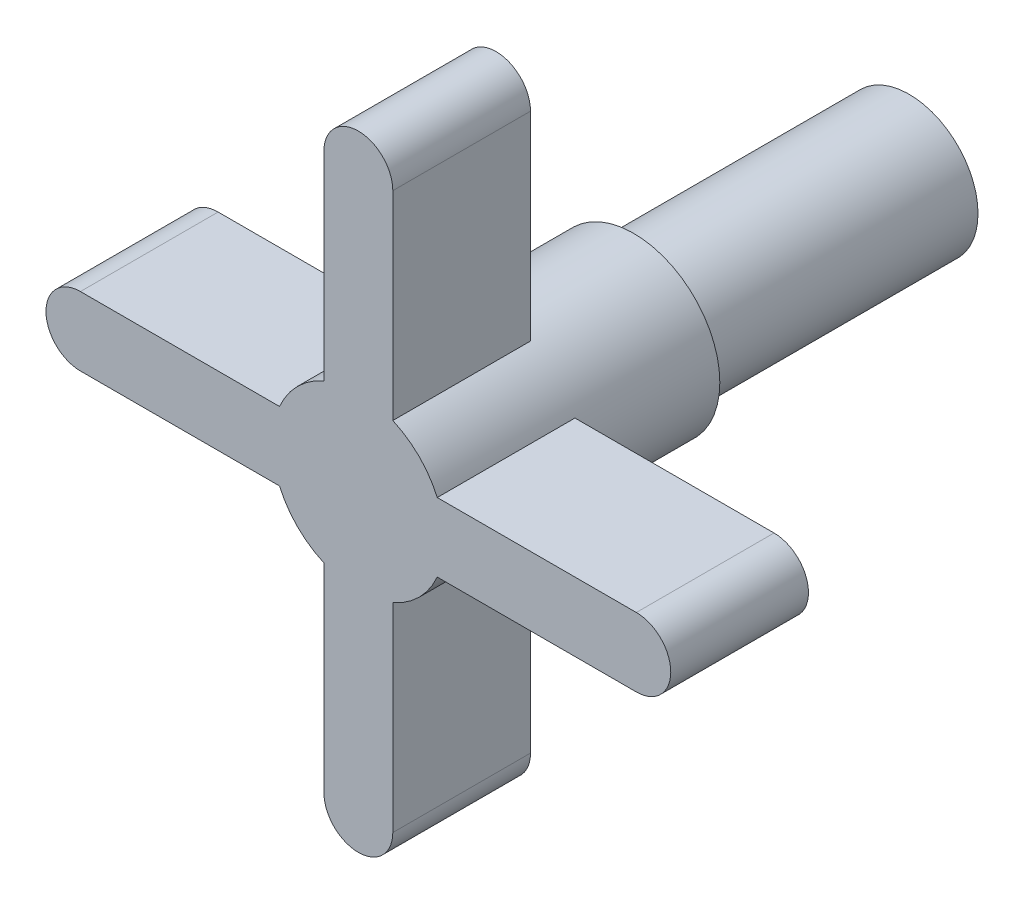
ISO-10303-21;
HEADER;
FILE_DESCRIPTION(('STEP AP214'),'2;1');
FILE_NAME('part.step','',(''),(''),'','','');
FILE_SCHEMA(('AUTOMOTIVE_DESIGN { 1 0 10303 214 1 1 1 1 }'));
ENDSEC;
DATA;
#1=APPLICATION_CONTEXT('core data for automotive mechanical design processes');
#2=APPLICATION_PROTOCOL_DEFINITION('international standard','automotive_design',2000,#1);
#3=PRODUCT_CONTEXT('',#1,'mechanical');
#4=PRODUCT('Part','Part','',(#3));
#5=PRODUCT_RELATED_PRODUCT_CATEGORY('part','',(#4));
#6=PRODUCT_DEFINITION_FORMATION('','',#4);
#7=PRODUCT_DEFINITION_CONTEXT('part definition',#1,'design');
#8=PRODUCT_DEFINITION('design','',#6,#7);
#9=PRODUCT_DEFINITION_SHAPE('','',#8);
#10=(LENGTH_UNIT() NAMED_UNIT(*) SI_UNIT(.MILLI.,.METRE.));
#11=(NAMED_UNIT(*) PLANE_ANGLE_UNIT() SI_UNIT($,.RADIAN.));
#12=(NAMED_UNIT(*) SI_UNIT($,.STERADIAN.) SOLID_ANGLE_UNIT());
#13=UNCERTAINTY_MEASURE_WITH_UNIT(LENGTH_MEASURE(1.E-05),#10,'distance_accuracy_value','');
#14=(GEOMETRIC_REPRESENTATION_CONTEXT(3) GLOBAL_UNCERTAINTY_ASSIGNED_CONTEXT((#13)) GLOBAL_UNIT_ASSIGNED_CONTEXT((#10,
#11,#12)) REPRESENTATION_CONTEXT('',''));
#15=CARTESIAN_POINT('',(0.,0.,0.));
#16=DIRECTION('',(0.,0.,1.));
#17=DIRECTION('',(1.,0.,0.));
#18=AXIS2_PLACEMENT_3D('',#15,#16,#17);
#19=CARTESIAN_POINT('',(-40.3732073682761,0.,0.));
#20=DIRECTION('',(0.,0.,1.));
#21=DIRECTION('',(1.,0.,0.));
#22=AXIS2_PLACEMENT_3D('',#19,#20,#21);
#23=PLANE('',#22);
#24=DIRECTION('',(0.,1.,0.));
#25=VECTOR('',#24,1.);
#26=CARTESIAN_POINT('',(5.00000000000004,4.99999999999994,0.));
#27=LINE('',#26,#25);
#28=CARTESIAN_POINT('',(5.00000000000003,11.4564392373896,0.));
#29=VERTEX_POINT('',#28);
#30=CARTESIAN_POINT('',(4.99999999999998,40.3732073682761,0.));
#31=VERTEX_POINT('',#30);
#32=EDGE_CURVE('E81',#29,#31,#27,.T.);
#33=ORIENTED_EDGE('',*,*,#32,.F.);
#34=CARTESIAN_POINT('',(0.,0.,0.));
#35=DIRECTION('',(0.,0.,1.));
#36=DIRECTION('',(1.,0.,0.));
#37=AXIS2_PLACEMENT_3D('',#34,#35,#36);
#38=CIRCLE('',#37,12.5);
#39=CARTESIAN_POINT('',(-4.99999999999999,11.4564392373896,0.));
#40=VERTEX_POINT('',#39);
#41=EDGE_CURVE('E207',#29,#40,#38,.T.);
#42=ORIENTED_EDGE('',*,*,#41,.T.);
#43=DIRECTION('',(0.,-1.,0.));
#44=VECTOR('',#43,1.);
#45=CARTESIAN_POINT('',(-5.0000000000001,40.3732073682761,0.));
#46=LINE('',#45,#44);
#47=CARTESIAN_POINT('',(-5.00000000000005,40.3732073682761,0.));
#48=VERTEX_POINT('',#47);
#49=EDGE_CURVE('E148',#48,#40,#46,.T.);
#50=ORIENTED_EDGE('',*,*,#49,.F.);
#51=CARTESIAN_POINT('',(0.,40.3732073682761,0.));
#52=DIRECTION('',(0.,0.,1.));
#53=DIRECTION('',(1.,0.,0.));
#54=AXIS2_PLACEMENT_3D('',#51,#52,#53);
#55=CIRCLE('',#54,5.00000000000004);
#56=EDGE_CURVE('E87',#31,#48,#55,.T.);
#57=ORIENTED_EDGE('',*,*,#56,.F.);
#58=EDGE_LOOP('',(#33,#42,#50,#57));
#59=FACE_BOUND('',#58,.T.);
#60=ADVANCED_FACE('F34',(#59),#23,.F.);
#61=DIRECTION('',(-1.,0.,0.));
#62=VECTOR('',#61,1.);
#63=CARTESIAN_POINT('',(-4.99999999999996,4.99999999999998,0.));
#64=LINE('',#63,#62);
#65=CARTESIAN_POINT('',(-11.4564392373896,4.99999999999998,0.));
#66=VERTEX_POINT('',#65);
#67=CARTESIAN_POINT('',(-40.3732073682761,4.99999999999998,0.));
#68=VERTEX_POINT('',#67);
#69=EDGE_CURVE('E151',#66,#68,#64,.T.);
#70=ORIENTED_EDGE('',*,*,#69,.F.);
#71=CARTESIAN_POINT('',(0.,0.,0.));
#72=DIRECTION('',(0.,0.,1.));
#73=DIRECTION('',(1.,0.,0.));
#74=AXIS2_PLACEMENT_3D('',#71,#72,#73);
#75=CIRCLE('',#74,12.5);
#76=CARTESIAN_POINT('',(-11.4564392373896,-5.00000000000003,0.));
#77=VERTEX_POINT('',#76);
#78=EDGE_CURVE('E225',#66,#77,#75,.T.);
#79=ORIENTED_EDGE('',*,*,#78,.T.);
#80=DIRECTION('',(1.,0.,0.));
#81=VECTOR('',#80,1.);
#82=CARTESIAN_POINT('',(-40.3732073682761,-5.0000000000001,0.));
#83=LINE('',#82,#81);
#84=CARTESIAN_POINT('',(-40.3732073682761,-5.00000000000004,0.));
#85=VERTEX_POINT('',#84);
#86=EDGE_CURVE('E156',#85,#77,#83,.T.);
#87=ORIENTED_EDGE('',*,*,#86,.F.);
#88=CARTESIAN_POINT('',(-40.3732073682761,0.,0.));
#89=DIRECTION('',(0.,0.,1.));
#90=DIRECTION('',(1.,0.,0.));
#91=AXIS2_PLACEMENT_3D('',#88,#89,#90);
#92=CIRCLE('',#91,5.00000000000004);
#93=EDGE_CURVE('E154',#68,#85,#92,.T.);
#94=ORIENTED_EDGE('',*,*,#93,.F.);
#95=EDGE_LOOP('',(#70,#79,#87,#94));
#96=FACE_BOUND('',#95,.T.);
#97=ADVANCED_FACE('F291',(#96),#23,.F.);
#98=DIRECTION('',(0.,-1.,0.));
#99=VECTOR('',#98,1.);
#100=CARTESIAN_POINT('',(-4.99999999999998,-5.00000000000002,0.));
#101=LINE('',#100,#99);
#102=CARTESIAN_POINT('',(-4.99999999999998,-11.4564392373896,0.));
#103=VERTEX_POINT('',#102);
#104=CARTESIAN_POINT('',(-4.99999999999998,-40.3732073682761,0.));
#105=VERTEX_POINT('',#104);
#106=EDGE_CURVE('E159',#103,#105,#101,.T.);
#107=ORIENTED_EDGE('',*,*,#106,.F.);
#108=CARTESIAN_POINT('',(0.,0.,0.));
#109=DIRECTION('',(0.,0.,1.));
#110=DIRECTION('',(1.,0.,0.));
#111=AXIS2_PLACEMENT_3D('',#108,#109,#110);
#112=CIRCLE('',#111,12.5);
#113=CARTESIAN_POINT('',(5.00000000000002,-11.4564392373896,0.));
#114=VERTEX_POINT('',#113);
#115=EDGE_CURVE('E216',#103,#114,#112,.T.);
#116=ORIENTED_EDGE('',*,*,#115,.T.);
#117=DIRECTION('',(0.,1.,0.));
#118=VECTOR('',#117,1.);
#119=CARTESIAN_POINT('',(5.0000000000001,-40.3732073682761,0.));
#120=LINE('',#119,#118);
#121=CARTESIAN_POINT('',(5.00000000000004,-40.3732073682761,0.));
#122=VERTEX_POINT('',#121);
#123=EDGE_CURVE('E163',#122,#114,#120,.T.);
#124=ORIENTED_EDGE('',*,*,#123,.F.);
#125=CARTESIAN_POINT('',(0.,-40.3732073682761,0.));
#126=DIRECTION('',(0.,0.,1.));
#127=DIRECTION('',(1.,0.,0.));
#128=AXIS2_PLACEMENT_3D('',#125,#126,#127);
#129=CIRCLE('',#128,5.00000000000004);
#130=EDGE_CURVE('E161',#105,#122,#129,.T.);
#131=ORIENTED_EDGE('',*,*,#130,.F.);
#132=EDGE_LOOP('',(#107,#116,#124,#131));
#133=FACE_BOUND('',#132,.T.);
#134=ADVANCED_FACE('F270',(#133),#23,.F.);
#135=CARTESIAN_POINT('',(-5.0000000000001,40.3732073682761,20.));
#136=DIRECTION('',(1.,0.,0.));
#137=DIRECTION('',(0.,1.,0.));
#138=AXIS2_PLACEMENT_3D('',#135,#136,#137);
#139=PLANE('',#138);
#140=ORIENTED_EDGE('',*,*,#49,.T.);
#141=DIRECTION('',(0.,0.,1.));
#142=VECTOR('',#141,1.);
#143=CARTESIAN_POINT('',(-4.99999999999999,11.4564392373896,-20.));
#144=LINE('',#143,#142);
#145=CARTESIAN_POINT('',(-4.99999999999999,11.4564392373896,20.));
#146=VERTEX_POINT('',#145);
#147=EDGE_CURVE('E210',#40,#146,#144,.T.);
#148=ORIENTED_EDGE('',*,*,#147,.T.);
#149=DIRECTION('',(0.,-1.,0.));
#150=VECTOR('',#149,1.);
#151=CARTESIAN_POINT('',(-5.0000000000001,40.3732073682761,20.));
#152=LINE('',#151,#150);
#153=CARTESIAN_POINT('',(-5.00000000000005,40.3732073682761,20.));
#154=VERTEX_POINT('',#153);
#155=EDGE_CURVE('E173',#154,#146,#152,.T.);
#156=ORIENTED_EDGE('',*,*,#155,.F.);
#157=DIRECTION('',(0.,0.,-1.));
#158=VECTOR('',#157,1.);
#159=CARTESIAN_POINT('',(-5.00000000000005,40.3732073682761,20.));
#160=LINE('',#159,#158);
#161=EDGE_CURVE('E147',#154,#48,#160,.T.);
#162=ORIENTED_EDGE('',*,*,#161,.T.);
#163=EDGE_LOOP('',(#140,#148,#156,#162));
#164=FACE_BOUND('',#163,.T.);
#165=ADVANCED_FACE('F36',(#164),#139,.F.);
#166=CARTESIAN_POINT('',(-4.99999999999996,4.99999999999998,20.));
#167=DIRECTION('',(0.,-1.,0.));
#168=DIRECTION('',(1.,0.,0.));
#169=AXIS2_PLACEMENT_3D('',#166,#167,#168);
#170=PLANE('',#169);
#171=DIRECTION('',(-1.,0.,0.));
#172=VECTOR('',#171,1.);
#173=CARTESIAN_POINT('',(-4.99999999999996,4.99999999999998,20.));
#174=LINE('',#173,#172);
#175=CARTESIAN_POINT('',(-11.4564392373896,4.99999999999998,20.));
#176=VERTEX_POINT('',#175);
#177=CARTESIAN_POINT('',(-40.3732073682761,4.99999999999998,20.));
#178=VERTEX_POINT('',#177);
#179=EDGE_CURVE('E95',#176,#178,#174,.T.);
#180=ORIENTED_EDGE('',*,*,#179,.F.);
#181=DIRECTION('',(0.,0.,1.));
#182=VECTOR('',#181,1.);
#183=CARTESIAN_POINT('',(-11.4564392373896,4.99999999999998,-20.));
#184=LINE('',#183,#182);
#185=EDGE_CURVE('E228',#176,#66,#184,.F.);
#186=ORIENTED_EDGE('',*,*,#185,.T.);
#187=ORIENTED_EDGE('',*,*,#69,.T.);
#188=DIRECTION('',(0.,0.,-1.));
#189=VECTOR('',#188,1.);
#190=CARTESIAN_POINT('',(-40.3732073682761,4.99999999999998,20.));
#191=LINE('',#190,#189);
#192=EDGE_CURVE('E43',#178,#68,#191,.T.);
#193=ORIENTED_EDGE('',*,*,#192,.F.);
#194=EDGE_LOOP('',(#180,#186,#187,#193));
#195=FACE_BOUND('',#194,.T.);
#196=ADVANCED_FACE('F315',(#195),#170,.F.);
#197=CARTESIAN_POINT('',(-40.3732073682761,0.,20.));
#198=DIRECTION('',(0.,0.,-1.));
#199=DIRECTION('',(-1.,0.,0.));
#200=AXIS2_PLACEMENT_3D('',#197,#198,#199);
#201=CYLINDRICAL_SURFACE('',#200,5.00000000000004);
#202=ORIENTED_EDGE('',*,*,#93,.T.);
#203=DIRECTION('',(0.,0.,-1.));
#204=VECTOR('',#203,1.);
#205=CARTESIAN_POINT('',(-40.3732073682761,-5.00000000000004,20.));
#206=LINE('',#205,#204);
#207=CARTESIAN_POINT('',(-40.3732073682761,-5.00000000000004,20.));
#208=VERTEX_POINT('',#207);
#209=EDGE_CURVE('E183',#208,#85,#206,.T.);
#210=ORIENTED_EDGE('',*,*,#209,.F.);
#211=CARTESIAN_POINT('',(-40.3732073682761,0.,20.));
#212=DIRECTION('',(0.,0.,1.));
#213=DIRECTION('',(1.,0.,0.));
#214=AXIS2_PLACEMENT_3D('',#211,#212,#213);
#215=CIRCLE('',#214,5.00000000000004);
#216=EDGE_CURVE('E235',#178,#208,#215,.T.);
#217=ORIENTED_EDGE('',*,*,#216,.F.);
#218=ORIENTED_EDGE('',*,*,#192,.T.);
#219=EDGE_LOOP('',(#202,#210,#217,#218));
#220=FACE_BOUND('',#219,.T.);
#221=ADVANCED_FACE('F320',(#220),#201,.T.);
#222=CARTESIAN_POINT('',(-40.3732073682761,-5.0000000000001,20.));
#223=DIRECTION('',(0.,1.,0.));
#224=DIRECTION('',(-1.,0.,0.));
#225=AXIS2_PLACEMENT_3D('',#222,#223,#224);
#226=PLANE('',#225);
#227=ORIENTED_EDGE('',*,*,#86,.T.);
#228=DIRECTION('',(0.,0.,1.));
#229=VECTOR('',#228,1.);
#230=CARTESIAN_POINT('',(-11.4564392373896,-5.00000000000003,-20.));
#231=LINE('',#230,#229);
#232=CARTESIAN_POINT('',(-11.4564392373896,-5.00000000000003,20.));
#233=VERTEX_POINT('',#232);
#234=EDGE_CURVE('E222',#77,#233,#231,.T.);
#235=ORIENTED_EDGE('',*,*,#234,.T.);
#236=DIRECTION('',(1.,0.,0.));
#237=VECTOR('',#236,1.);
#238=CARTESIAN_POINT('',(-40.3732073682761,-5.0000000000001,20.));
#239=LINE('',#238,#237);
#240=EDGE_CURVE('E237',#208,#233,#239,.T.);
#241=ORIENTED_EDGE('',*,*,#240,.F.);
#242=ORIENTED_EDGE('',*,*,#209,.T.);
#243=EDGE_LOOP('',(#227,#235,#241,#242));
#244=FACE_BOUND('',#243,.T.);
#245=ADVANCED_FACE('F288',(#244),#226,.F.);
#246=CARTESIAN_POINT('',(-4.99999999999998,-5.00000000000002,20.));
#247=DIRECTION('',(1.,0.,0.));
#248=DIRECTION('',(0.,1.,0.));
#249=AXIS2_PLACEMENT_3D('',#246,#247,#248);
#250=PLANE('',#249);
#251=DIRECTION('',(0.,-1.,0.));
#252=VECTOR('',#251,1.);
#253=CARTESIAN_POINT('',(-4.99999999999998,-5.00000000000002,20.));
#254=LINE('',#253,#252);
#255=CARTESIAN_POINT('',(-4.99999999999998,-11.4564392373896,20.));
#256=VERTEX_POINT('',#255);
#257=CARTESIAN_POINT('',(-4.99999999999998,-40.3732073682761,20.));
#258=VERTEX_POINT('',#257);
#259=EDGE_CURVE('E240',#256,#258,#254,.T.);
#260=ORIENTED_EDGE('',*,*,#259,.F.);
#261=DIRECTION('',(0.,0.,1.));
#262=VECTOR('',#261,1.);
#263=CARTESIAN_POINT('',(-4.99999999999998,-11.4564392373896,-20.));
#264=LINE('',#263,#262);
#265=EDGE_CURVE('E219',#256,#103,#264,.F.);
#266=ORIENTED_EDGE('',*,*,#265,.T.);
#267=ORIENTED_EDGE('',*,*,#106,.T.);
#268=DIRECTION('',(0.,0.,-1.));
#269=VECTOR('',#268,1.);
#270=CARTESIAN_POINT('',(-4.99999999999998,-40.3732073682761,20.));
#271=LINE('',#270,#269);
#272=EDGE_CURVE('E180',#258,#105,#271,.T.);
#273=ORIENTED_EDGE('',*,*,#272,.F.);
#274=EDGE_LOOP('',(#260,#266,#267,#273));
#275=FACE_BOUND('',#274,.T.);
#276=ADVANCED_FACE('F277',(#275),#250,.F.);
#277=CARTESIAN_POINT('',(0.,-40.3732073682761,20.));
#278=DIRECTION('',(0.,0.,-1.));
#279=DIRECTION('',(-1.,0.,0.));
#280=AXIS2_PLACEMENT_3D('',#277,#278,#279);
#281=CYLINDRICAL_SURFACE('',#280,5.00000000000004);
#282=ORIENTED_EDGE('',*,*,#130,.T.);
#283=DIRECTION('',(0.,0.,-1.));
#284=VECTOR('',#283,1.);
#285=CARTESIAN_POINT('',(5.00000000000004,-40.3732073682761,20.));
#286=LINE('',#285,#284);
#287=CARTESIAN_POINT('',(5.00000000000004,-40.3732073682761,20.));
#288=VERTEX_POINT('',#287);
#289=EDGE_CURVE('E177',#288,#122,#286,.T.);
#290=ORIENTED_EDGE('',*,*,#289,.F.);
#291=CARTESIAN_POINT('',(0.,-40.3732073682761,20.));
#292=DIRECTION('',(0.,0.,1.));
#293=DIRECTION('',(1.,0.,0.));
#294=AXIS2_PLACEMENT_3D('',#291,#292,#293);
#295=CIRCLE('',#294,5.00000000000004);
#296=EDGE_CURVE('E242',#258,#288,#295,.T.);
#297=ORIENTED_EDGE('',*,*,#296,.F.);
#298=ORIENTED_EDGE('',*,*,#272,.T.);
#299=EDGE_LOOP('',(#282,#290,#297,#298));
#300=FACE_BOUND('',#299,.T.);
#301=ADVANCED_FACE('F279',(#300),#281,.T.);
#302=CARTESIAN_POINT('',(5.0000000000001,-40.3732073682761,20.));
#303=DIRECTION('',(-1.,0.,0.));
#304=DIRECTION('',(0.,-1.,0.));
#305=AXIS2_PLACEMENT_3D('',#302,#303,#304);
#306=PLANE('',#305);
#307=ORIENTED_EDGE('',*,*,#123,.T.);
#308=DIRECTION('',(0.,0.,1.));
#309=VECTOR('',#308,1.);
#310=CARTESIAN_POINT('',(5.00000000000002,-11.4564392373896,-20.));
#311=LINE('',#310,#309);
#312=CARTESIAN_POINT('',(5.00000000000002,-11.4564392373896,20.));
#313=VERTEX_POINT('',#312);
#314=EDGE_CURVE('E213',#114,#313,#311,.T.);
#315=ORIENTED_EDGE('',*,*,#314,.T.);
#316=DIRECTION('',(0.,1.,0.));
#317=VECTOR('',#316,1.);
#318=CARTESIAN_POINT('',(5.0000000000001,-40.3732073682761,20.));
#319=LINE('',#318,#317);
#320=EDGE_CURVE('E244',#288,#313,#319,.T.);
#321=ORIENTED_EDGE('',*,*,#320,.F.);
#322=ORIENTED_EDGE('',*,*,#289,.T.);
#323=EDGE_LOOP('',(#307,#315,#321,#322));
#324=FACE_BOUND('',#323,.T.);
#325=ADVANCED_FACE('F255',(#324),#306,.F.);
#326=CARTESIAN_POINT('',(5.00000000000001,-5.00000000000006,20.));
#327=DIRECTION('',(0.,1.,0.));
#328=DIRECTION('',(-1.,0.,0.));
#329=AXIS2_PLACEMENT_3D('',#326,#327,#328);
#330=PLANE('',#329);
#331=DIRECTION('',(1.,0.,0.));
#332=VECTOR('',#331,1.);
#333=CARTESIAN_POINT('',(5.00000000000001,-5.00000000000006,20.));
#334=LINE('',#333,#332);
#335=CARTESIAN_POINT('',(11.4564392373896,-5.00000000000004,20.));
#336=VERTEX_POINT('',#335);
#337=CARTESIAN_POINT('',(40.3732073682761,-4.99999999999998,20.));
#338=VERTEX_POINT('',#337);
#339=EDGE_CURVE('E121',#336,#338,#334,.T.);
#340=ORIENTED_EDGE('',*,*,#339,.F.);
#341=DIRECTION('',(0.,0.,1.));
#342=VECTOR('',#341,1.);
#343=CARTESIAN_POINT('',(11.4564392373896,-5.00000000000004,-20.));
#344=LINE('',#343,#342);
#345=CARTESIAN_POINT('',(11.4564392373896,-5.00000000000004,0.));
#346=VERTEX_POINT('',#345);
#347=EDGE_CURVE('E192',#336,#346,#344,.F.);
#348=ORIENTED_EDGE('',*,*,#347,.T.);
#349=DIRECTION('',(1.,0.,0.));
#350=VECTOR('',#349,1.);
#351=CARTESIAN_POINT('',(5.00000000000001,-5.00000000000006,0.));
#352=LINE('',#351,#350);
#353=CARTESIAN_POINT('',(40.3732073682761,-4.99999999999998,0.));
#354=VERTEX_POINT('',#353);
#355=EDGE_CURVE('E166',#346,#354,#352,.T.);
#356=ORIENTED_EDGE('',*,*,#355,.T.);
#357=DIRECTION('',(0.,0.,-1.));
#358=VECTOR('',#357,1.);
#359=CARTESIAN_POINT('',(40.3732073682761,-4.99999999999998,20.));
#360=LINE('',#359,#358);
#361=EDGE_CURVE('E134',#338,#354,#360,.T.);
#362=ORIENTED_EDGE('',*,*,#361,.F.);
#363=EDGE_LOOP('',(#340,#348,#356,#362));
#364=FACE_BOUND('',#363,.T.);
#365=ADVANCED_FACE('F286',(#364),#330,.F.);
#366=CARTESIAN_POINT('',(40.3732073682761,0.,20.));
#367=DIRECTION('',(0.,0.,-1.));
#368=DIRECTION('',(-1.,0.,0.));
#369=AXIS2_PLACEMENT_3D('',#366,#367,#368);
#370=CYLINDRICAL_SURFACE('',#369,5.00000000000004);
#371=CARTESIAN_POINT('',(40.3732073682761,0.,0.));
#372=DIRECTION('',(0.,0.,1.));
#373=DIRECTION('',(1.,0.,0.));
#374=AXIS2_PLACEMENT_3D('',#371,#372,#373);
#375=CIRCLE('',#374,5.00000000000004);
#376=CARTESIAN_POINT('',(40.3732073682761,5.00000000000005,0.));
#377=VERTEX_POINT('',#376);
#378=EDGE_CURVE('E130',#354,#377,#375,.T.);
#379=ORIENTED_EDGE('',*,*,#378,.T.);
#380=DIRECTION('',(0.,0.,-1.));
#381=VECTOR('',#380,1.);
#382=CARTESIAN_POINT('',(40.3732073682761,5.00000000000005,20.));
#383=LINE('',#382,#381);
#384=CARTESIAN_POINT('',(40.3732073682761,5.00000000000005,20.));
#385=VERTEX_POINT('',#384);
#386=EDGE_CURVE('E127',#385,#377,#383,.T.);
#387=ORIENTED_EDGE('',*,*,#386,.F.);
#388=CARTESIAN_POINT('',(40.3732073682761,0.,20.));
#389=DIRECTION('',(0.,0.,1.));
#390=DIRECTION('',(1.,0.,0.));
#391=AXIS2_PLACEMENT_3D('',#388,#389,#390);
#392=CIRCLE('',#391,5.00000000000004);
#393=EDGE_CURVE('E112',#338,#385,#392,.T.);
#394=ORIENTED_EDGE('',*,*,#393,.F.);
#395=ORIENTED_EDGE('',*,*,#361,.T.);
#396=EDGE_LOOP('',(#379,#387,#394,#395));
#397=FACE_BOUND('',#396,.T.);
#398=ADVANCED_FACE('F128',(#397),#370,.T.);
#399=CARTESIAN_POINT('',(40.3732073682761,5.00000000000011,20.));
#400=DIRECTION('',(0.,-1.,0.));
#401=DIRECTION('',(1.,0.,0.));
#402=AXIS2_PLACEMENT_3D('',#399,#400,#401);
#403=PLANE('',#402);
#404=DIRECTION('',(-1.,0.,0.));
#405=VECTOR('',#404,1.);
#406=CARTESIAN_POINT('',(40.3732073682761,5.00000000000011,0.));
#407=LINE('',#406,#405);
#408=CARTESIAN_POINT('',(11.4564392373896,4.99999999999997,0.));
#409=VERTEX_POINT('',#408);
#410=EDGE_CURVE('E169',#377,#409,#407,.T.);
#411=ORIENTED_EDGE('',*,*,#410,.T.);
#412=DIRECTION('',(0.,0.,1.));
#413=VECTOR('',#412,1.);
#414=CARTESIAN_POINT('',(11.4564392373896,4.99999999999997,-20.));
#415=LINE('',#414,#413);
#416=CARTESIAN_POINT('',(11.4564392373896,4.99999999999997,20.));
#417=VERTEX_POINT('',#416);
#418=EDGE_CURVE('E140',#409,#417,#415,.T.);
#419=ORIENTED_EDGE('',*,*,#418,.T.);
#420=DIRECTION('',(-1.,0.,0.));
#421=VECTOR('',#420,1.);
#422=CARTESIAN_POINT('',(40.3732073682761,5.00000000000011,20.));
#423=LINE('',#422,#421);
#424=EDGE_CURVE('E118',#385,#417,#423,.T.);
#425=ORIENTED_EDGE('',*,*,#424,.F.);
#426=ORIENTED_EDGE('',*,*,#386,.T.);
#427=EDGE_LOOP('',(#411,#419,#425,#426));
#428=FACE_BOUND('',#427,.T.);
#429=ADVANCED_FACE('F138',(#428),#403,.F.);
#430=CARTESIAN_POINT('',(5.00000000000004,4.99999999999994,20.));
#431=DIRECTION('',(-1.,0.,0.));
#432=DIRECTION('',(0.,-1.,0.));
#433=AXIS2_PLACEMENT_3D('',#430,#431,#432);
#434=PLANE('',#433);
#435=DIRECTION('',(0.,1.,0.));
#436=VECTOR('',#435,1.);
#437=CARTESIAN_POINT('',(5.00000000000004,4.99999999999994,20.));
#438=LINE('',#437,#436);
#439=CARTESIAN_POINT('',(5.00000000000003,11.4564392373896,20.));
#440=VERTEX_POINT('',#439);
#441=CARTESIAN_POINT('',(4.99999999999998,40.3732073682761,20.));
#442=VERTEX_POINT('',#441);
#443=EDGE_CURVE('E141',#440,#442,#438,.T.);
#444=ORIENTED_EDGE('',*,*,#443,.F.);
#445=DIRECTION('',(0.,0.,1.));
#446=VECTOR('',#445,1.);
#447=CARTESIAN_POINT('',(5.00000000000003,11.4564392373896,-20.));
#448=LINE('',#447,#446);
#449=EDGE_CURVE('E205',#440,#29,#448,.F.);
#450=ORIENTED_EDGE('',*,*,#449,.T.);
#451=ORIENTED_EDGE('',*,*,#32,.T.);
#452=DIRECTION('',(0.,0.,-1.));
#453=VECTOR('',#452,1.);
#454=CARTESIAN_POINT('',(4.99999999999998,40.3732073682761,20.));
#455=LINE('',#454,#453);
#456=EDGE_CURVE('E135',#442,#31,#455,.T.);
#457=ORIENTED_EDGE('',*,*,#456,.F.);
#458=EDGE_LOOP('',(#444,#450,#451,#457));
#459=FACE_BOUND('',#458,.T.);
#460=ADVANCED_FACE('F336',(#459),#434,.F.);
#461=CARTESIAN_POINT('',(0.,40.3732073682761,20.));
#462=DIRECTION('',(0.,0.,-1.));
#463=DIRECTION('',(-1.,0.,0.));
#464=AXIS2_PLACEMENT_3D('',#461,#462,#463);
#465=CYLINDRICAL_SURFACE('',#464,5.00000000000004);
#466=ORIENTED_EDGE('',*,*,#56,.T.);
#467=ORIENTED_EDGE('',*,*,#161,.F.);
#468=CARTESIAN_POINT('',(0.,40.3732073682761,20.));
#469=DIRECTION('',(0.,0.,1.));
#470=DIRECTION('',(1.,0.,0.));
#471=AXIS2_PLACEMENT_3D('',#468,#469,#470);
#472=CIRCLE('',#471,5.00000000000004);
#473=EDGE_CURVE('E51',#442,#154,#472,.T.);
#474=ORIENTED_EDGE('',*,*,#473,.F.);
#475=ORIENTED_EDGE('',*,*,#456,.T.);
#476=EDGE_LOOP('',(#466,#467,#474,#475));
#477=FACE_BOUND('',#476,.T.);
#478=ADVANCED_FACE('F309',(#477),#465,.T.);
#479=CARTESIAN_POINT('',(-40.3732073682761,0.,20.));
#480=DIRECTION('',(0.,0.,1.));
#481=DIRECTION('',(1.,0.,0.));
#482=AXIS2_PLACEMENT_3D('',#479,#480,#481);
#483=PLANE('',#482);
#484=CARTESIAN_POINT('',(0.,0.,20.));
#485=DIRECTION('',(0.,0.,1.));
#486=DIRECTION('',(1.,0.,0.));
#487=AXIS2_PLACEMENT_3D('',#484,#485,#486);
#488=CIRCLE('',#487,12.5);
#489=EDGE_CURVE('E199',#146,#176,#488,.T.);
#490=ORIENTED_EDGE('',*,*,#489,.T.);
#491=ORIENTED_EDGE('',*,*,#179,.T.);
#492=ORIENTED_EDGE('',*,*,#216,.T.);
#493=ORIENTED_EDGE('',*,*,#240,.T.);
#494=EDGE_CURVE('E362',#233,#256,#488,.T.);
#495=ORIENTED_EDGE('',*,*,#494,.T.);
#496=ORIENTED_EDGE('',*,*,#259,.T.);
#497=ORIENTED_EDGE('',*,*,#296,.T.);
#498=ORIENTED_EDGE('',*,*,#320,.T.);
#499=EDGE_CURVE('E201',#313,#336,#488,.T.);
#500=ORIENTED_EDGE('',*,*,#499,.T.);
#501=ORIENTED_EDGE('',*,*,#339,.T.);
#502=ORIENTED_EDGE('',*,*,#393,.T.);
#503=ORIENTED_EDGE('',*,*,#424,.T.);
#504=EDGE_CURVE('E195',#417,#440,#488,.T.);
#505=ORIENTED_EDGE('',*,*,#504,.T.);
#506=ORIENTED_EDGE('',*,*,#443,.T.);
#507=ORIENTED_EDGE('',*,*,#473,.T.);
#508=ORIENTED_EDGE('',*,*,#155,.T.);
#509=EDGE_LOOP('',(#490,#491,#492,#493,#495,#496,#497,#498,#500,#501,#502,#503,#505,#506,#507,#508));
#510=FACE_BOUND('',#509,.T.);
#511=ADVANCED_FACE('F114',(#510),#483,.T.);
#512=ORIENTED_EDGE('',*,*,#355,.F.);
#513=CARTESIAN_POINT('',(0.,0.,0.));
#514=DIRECTION('',(0.,0.,1.));
#515=DIRECTION('',(1.,0.,0.));
#516=AXIS2_PLACEMENT_3D('',#513,#514,#515);
#517=CIRCLE('',#516,12.5);
#518=EDGE_CURVE('E11',#346,#409,#517,.T.);
#519=ORIENTED_EDGE('',*,*,#518,.T.);
#520=ORIENTED_EDGE('',*,*,#410,.F.);
#521=ORIENTED_EDGE('',*,*,#378,.F.);
#522=EDGE_LOOP('',(#512,#519,#520,#521));
#523=FACE_BOUND('',#522,.T.);
#524=ADVANCED_FACE('F294',(#523),#23,.F.);
#525=CARTESIAN_POINT('',(0.,0.,-20.));
#526=DIRECTION('',(0.,0.,1.));
#527=DIRECTION('',(1.,0.,0.));
#528=AXIS2_PLACEMENT_3D('',#525,#526,#527);
#529=CYLINDRICAL_SURFACE('',#528,12.5);
#530=CARTESIAN_POINT('',(0.,0.,-20.));
#531=DIRECTION('',(0.,0.,1.));
#532=DIRECTION('',(1.,0.,0.));
#533=AXIS2_PLACEMENT_3D('',#530,#531,#532);
#534=CIRCLE('',#533,12.5);
#535=CARTESIAN_POINT('',(12.5,0.,-20.));
#536=VERTEX_POINT('',#535);
#537=EDGE_CURVE('E189',#536,#536,#534,.T.);
#538=ORIENTED_EDGE('',*,*,#537,.T.);
#539=EDGE_LOOP('',(#538));
#540=FACE_BOUND('',#539,.T.);
#541=ORIENTED_EDGE('',*,*,#185,.F.);
#542=ORIENTED_EDGE('',*,*,#489,.F.);
#543=ORIENTED_EDGE('',*,*,#147,.F.);
#544=ORIENTED_EDGE('',*,*,#41,.F.);
#545=ORIENTED_EDGE('',*,*,#449,.F.);
#546=ORIENTED_EDGE('',*,*,#504,.F.);
#547=ORIENTED_EDGE('',*,*,#418,.F.);
#548=ORIENTED_EDGE('',*,*,#518,.F.);
#549=ORIENTED_EDGE('',*,*,#347,.F.);
#550=ORIENTED_EDGE('',*,*,#499,.F.);
#551=ORIENTED_EDGE('',*,*,#314,.F.);
#552=ORIENTED_EDGE('',*,*,#115,.F.);
#553=ORIENTED_EDGE('',*,*,#265,.F.);
#554=ORIENTED_EDGE('',*,*,#494,.F.);
#555=ORIENTED_EDGE('',*,*,#234,.F.);
#556=ORIENTED_EDGE('',*,*,#78,.F.);
#557=EDGE_LOOP('',(#541,#542,#543,#544,#545,#546,#547,#548,#549,#550,#551,#552,#553,#554,#555,#556));
#558=FACE_BOUND('',#557,.T.);
#559=ADVANCED_FACE('F262',(#540,#558),#529,.T.);
#560=CARTESIAN_POINT('',(0.,0.,-20.));
#561=DIRECTION('',(0.,0.,1.));
#562=DIRECTION('',(1.,0.,0.));
#563=AXIS2_PLACEMENT_3D('',#560,#561,#562);
#564=PLANE('',#563);
#565=CARTESIAN_POINT('',(0.,0.,-20.));
#566=DIRECTION('',(0.,0.,1.));
#567=DIRECTION('',(1.,0.,0.));
#568=AXIS2_PLACEMENT_3D('',#565,#566,#567);
#569=CIRCLE('',#568,10.);
#570=CARTESIAN_POINT('',(10.,0.,-20.));
#571=VERTEX_POINT('',#570);
#572=EDGE_CURVE('E187',#571,#571,#569,.F.);
#573=ORIENTED_EDGE('',*,*,#572,.F.);
#574=EDGE_LOOP('',(#573));
#575=FACE_BOUND('',#574,.T.);
#576=ORIENTED_EDGE('',*,*,#537,.F.);
#577=EDGE_LOOP('',(#576));
#578=FACE_BOUND('',#577,.T.);
#579=ADVANCED_FACE('F307',(#575,#578),#564,.F.);
#580=CARTESIAN_POINT('',(0.,0.,-60.));
#581=DIRECTION('',(0.,0.,1.));
#582=DIRECTION('',(1.,0.,0.));
#583=AXIS2_PLACEMENT_3D('',#580,#581,#582);
#584=PLANE('',#583);
#585=CARTESIAN_POINT('',(0.,0.,-60.));
#586=DIRECTION('',(0.,0.,1.));
#587=DIRECTION('',(1.,0.,0.));
#588=AXIS2_PLACEMENT_3D('',#585,#586,#587);
#589=CIRCLE('',#588,10.);
#590=CARTESIAN_POINT('',(10.,0.,-60.));
#591=VERTEX_POINT('',#590);
#592=EDGE_CURVE('E152',#591,#591,#589,.T.);
#593=ORIENTED_EDGE('',*,*,#592,.F.);
#594=EDGE_LOOP('',(#593));
#595=FACE_BOUND('',#594,.T.);
#596=ADVANCED_FACE('F452',(#595),#584,.F.);
#597=CARTESIAN_POINT('',(0.,0.,-60.));
#598=DIRECTION('',(0.,0.,1.));
#599=DIRECTION('',(1.,0.,0.));
#600=AXIS2_PLACEMENT_3D('',#597,#598,#599);
#601=CYLINDRICAL_SURFACE('',#600,10.);
#602=ORIENTED_EDGE('',*,*,#592,.T.);
#603=EDGE_LOOP('',(#602));
#604=FACE_BOUND('',#603,.T.);
#605=ORIENTED_EDGE('',*,*,#572,.T.);
#606=EDGE_LOOP('',(#605));
#607=FACE_BOUND('',#606,.T.);
#608=ADVANCED_FACE('F459',(#604,#607),#601,.T.);
#609=CLOSED_SHELL('',(#60,#97,#134,#165,#196,#221,#245,#276,#301,#325,#365,#398,#429,#460,#478,
#511,#524,#559,#579,#596,#608));
#610=MANIFOLD_SOLID_BREP('B2',#609);
#611=ADVANCED_BREP_SHAPE_REPRESENTATION('',(#18,#610),#14);
#612=SHAPE_DEFINITION_REPRESENTATION(#9,#611);
ENDSEC;
END-ISO-10303-21;
